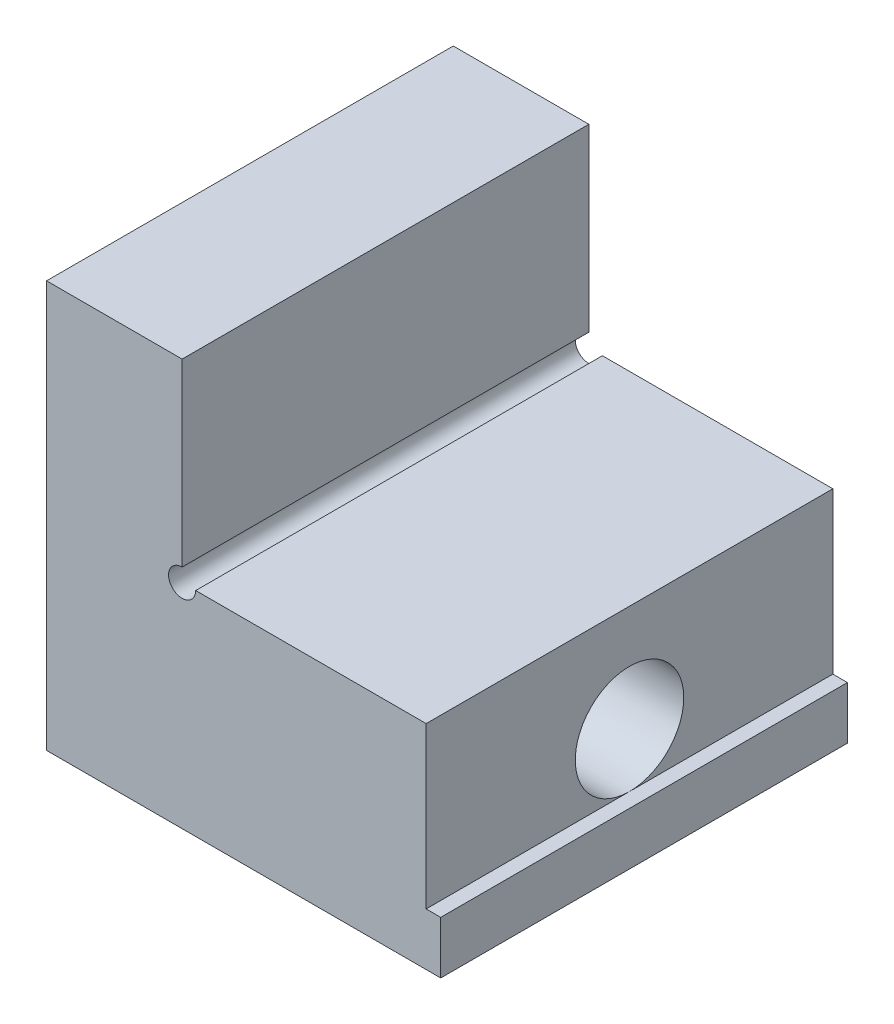
ISO-10303-21;
HEADER;
FILE_DESCRIPTION(('STEP AP214'),'2;1');
FILE_NAME('part.step','',(''),(''),'','','');
FILE_SCHEMA(('AUTOMOTIVE_DESIGN { 1 0 10303 214 1 1 1 1 }'));
ENDSEC;
DATA;
#1=APPLICATION_CONTEXT('core data for automotive mechanical design processes');
#2=APPLICATION_PROTOCOL_DEFINITION('international standard','automotive_design',2000,#1);
#3=PRODUCT_CONTEXT('',#1,'mechanical');
#4=PRODUCT('Part','Part','',(#3));
#5=PRODUCT_RELATED_PRODUCT_CATEGORY('part','',(#4));
#6=PRODUCT_DEFINITION_FORMATION('','',#4);
#7=PRODUCT_DEFINITION_CONTEXT('part definition',#1,'design');
#8=PRODUCT_DEFINITION('design','',#6,#7);
#9=PRODUCT_DEFINITION_SHAPE('','',#8);
#10=(LENGTH_UNIT() NAMED_UNIT(*) SI_UNIT(.MILLI.,.METRE.));
#11=(NAMED_UNIT(*) PLANE_ANGLE_UNIT() SI_UNIT($,.RADIAN.));
#12=(NAMED_UNIT(*) SI_UNIT($,.STERADIAN.) SOLID_ANGLE_UNIT());
#13=UNCERTAINTY_MEASURE_WITH_UNIT(LENGTH_MEASURE(1.E-05),#10,'distance_accuracy_value','');
#14=(GEOMETRIC_REPRESENTATION_CONTEXT(3) GLOBAL_UNCERTAINTY_ASSIGNED_CONTEXT((#13)) GLOBAL_UNIT_ASSIGNED_CONTEXT((#10,
#11,#12)) REPRESENTATION_CONTEXT('',''));
#15=CARTESIAN_POINT('',(0.,0.,0.));
#16=DIRECTION('',(0.,0.,1.));
#17=DIRECTION('',(1.,0.,0.));
#18=AXIS2_PLACEMENT_3D('',#15,#16,#17);
#19=CARTESIAN_POINT('',(0.,0.,15.));
#20=DIRECTION('',(0.,0.,-1.));
#21=DIRECTION('',(-1.,0.,0.));
#22=AXIS2_PLACEMENT_3D('',#19,#20,#21);
#23=CYLINDRICAL_SURFACE('',#22,1.);
#24=DIRECTION('',(0.,0.,-1.));
#25=VECTOR('',#24,1.);
#26=CARTESIAN_POINT('',(1.,0.,15.));
#27=LINE('',#26,#25);
#28=CARTESIAN_POINT('',(1.,0.,15.));
#29=VERTEX_POINT('',#28);
#30=CARTESIAN_POINT('',(1.,0.,-15.));
#31=VERTEX_POINT('',#30);
#32=EDGE_CURVE('E58',#29,#31,#27,.T.);
#33=ORIENTED_EDGE('',*,*,#32,.T.);
#34=CARTESIAN_POINT('',(0.,0.,-15.));
#35=DIRECTION('',(0.,0.,1.));
#36=DIRECTION('',(1.,0.,0.));
#37=AXIS2_PLACEMENT_3D('',#34,#35,#36);
#38=CIRCLE('',#37,1.);
#39=CARTESIAN_POINT('',(0.,1.,-15.));
#40=VERTEX_POINT('',#39);
#41=EDGE_CURVE('E124',#40,#31,#38,.T.);
#42=ORIENTED_EDGE('',*,*,#41,.F.);
#43=DIRECTION('',(0.,0.,-1.));
#44=VECTOR('',#43,1.);
#45=CARTESIAN_POINT('',(0.,1.,15.));
#46=LINE('',#45,#44);
#47=CARTESIAN_POINT('',(0.,1.,15.));
#48=VERTEX_POINT('',#47);
#49=EDGE_CURVE('E11',#48,#40,#46,.T.);
#50=ORIENTED_EDGE('',*,*,#49,.F.);
#51=CARTESIAN_POINT('',(0.,0.,15.));
#52=DIRECTION('',(0.,0.,1.));
#53=DIRECTION('',(1.,0.,0.));
#54=AXIS2_PLACEMENT_3D('',#51,#52,#53);
#55=CIRCLE('',#54,1.);
#56=EDGE_CURVE('E151',#48,#29,#55,.T.);
#57=ORIENTED_EDGE('',*,*,#56,.T.);
#58=EDGE_LOOP('',(#33,#42,#50,#57));
#59=FACE_BOUND('',#58,.T.);
#60=ADVANCED_FACE('F37',(#59),#23,.F.);
#61=CARTESIAN_POINT('',(0.,0.,15.));
#62=DIRECTION('',(1.,0.,0.));
#63=DIRECTION('',(0.,1.,0.));
#64=AXIS2_PLACEMENT_3D('',#61,#62,#63);
#65=PLANE('',#64);
#66=ORIENTED_EDGE('',*,*,#49,.T.);
#67=DIRECTION('',(0.,-1.,0.));
#68=VECTOR('',#67,1.);
#69=CARTESIAN_POINT('',(0.,0.,-15.));
#70=LINE('',#69,#68);
#71=CARTESIAN_POINT('',(0.,14.2850389755494,-15.));
#72=VERTEX_POINT('',#71);
#73=EDGE_CURVE('E113',#72,#40,#70,.T.);
#74=ORIENTED_EDGE('',*,*,#73,.F.);
#75=DIRECTION('',(0.,0.,-1.));
#76=VECTOR('',#75,1.);
#77=CARTESIAN_POINT('',(0.,14.2850389755494,15.));
#78=LINE('',#77,#76);
#79=CARTESIAN_POINT('',(0.,14.2850389755494,15.));
#80=VERTEX_POINT('',#79);
#81=EDGE_CURVE('E45',#80,#72,#78,.T.);
#82=ORIENTED_EDGE('',*,*,#81,.F.);
#83=DIRECTION('',(0.,-1.,0.));
#84=VECTOR('',#83,1.);
#85=CARTESIAN_POINT('',(0.,0.,15.));
#86=LINE('',#85,#84);
#87=EDGE_CURVE('E115',#80,#48,#86,.T.);
#88=ORIENTED_EDGE('',*,*,#87,.T.);
#89=EDGE_LOOP('',(#66,#74,#82,#88));
#90=FACE_BOUND('',#89,.T.);
#91=ADVANCED_FACE('F112',(#90),#65,.T.);
#92=CARTESIAN_POINT('',(0.,14.2850389755494,15.));
#93=DIRECTION('',(0.,1.,0.));
#94=DIRECTION('',(0.,0.,1.));
#95=AXIS2_PLACEMENT_3D('',#92,#93,#94);
#96=PLANE('',#95);
#97=ORIENTED_EDGE('',*,*,#81,.T.);
#98=DIRECTION('',(1.,0.,0.));
#99=VECTOR('',#98,1.);
#100=CARTESIAN_POINT('',(0.,14.2850389755494,-15.));
#101=LINE('',#100,#99);
#102=CARTESIAN_POINT('',(-10.,14.2850389755494,-15.));
#103=VERTEX_POINT('',#102);
#104=EDGE_CURVE('E127',#103,#72,#101,.T.);
#105=ORIENTED_EDGE('',*,*,#104,.F.);
#106=DIRECTION('',(0.,0.,-1.));
#107=VECTOR('',#106,1.);
#108=CARTESIAN_POINT('',(-10.,14.2850389755494,15.));
#109=LINE('',#108,#107);
#110=CARTESIAN_POINT('',(-10.,14.2850389755494,15.));
#111=VERTEX_POINT('',#110);
#112=EDGE_CURVE('E187',#111,#103,#109,.T.);
#113=ORIENTED_EDGE('',*,*,#112,.F.);
#114=DIRECTION('',(1.,0.,0.));
#115=VECTOR('',#114,1.);
#116=CARTESIAN_POINT('',(0.,14.2850389755494,15.));
#117=LINE('',#116,#115);
#118=EDGE_CURVE('E154',#111,#80,#117,.T.);
#119=ORIENTED_EDGE('',*,*,#118,.T.);
#120=EDGE_LOOP('',(#97,#105,#113,#119));
#121=FACE_BOUND('',#120,.T.);
#122=ADVANCED_FACE('F215',(#121),#96,.T.);
#123=CARTESIAN_POINT('',(-10.,0.,15.));
#124=DIRECTION('',(-1.,0.,0.));
#125=DIRECTION('',(0.,0.,1.));
#126=AXIS2_PLACEMENT_3D('',#123,#124,#125);
#127=PLANE('',#126);
#128=CARTESIAN_POINT('',(-10.,-7.84,0.));
#129=DIRECTION('',(-1.,0.,0.));
#130=DIRECTION('',(0.,0.,1.));
#131=AXIS2_PLACEMENT_3D('',#128,#129,#130);
#132=CIRCLE('',#131,6.5);
#133=CARTESIAN_POINT('',(-10.,-7.84,6.5));
#134=VERTEX_POINT('',#133);
#135=EDGE_CURVE('E40',#134,#134,#132,.T.);
#136=ORIENTED_EDGE('',*,*,#135,.F.);
#137=EDGE_LOOP('',(#136));
#138=FACE_BOUND('',#137,.T.);
#139=ORIENTED_EDGE('',*,*,#112,.T.);
#140=DIRECTION('',(0.,1.,0.));
#141=VECTOR('',#140,1.);
#142=CARTESIAN_POINT('',(-10.,0.,-15.));
#143=LINE('',#142,#141);
#144=CARTESIAN_POINT('',(-10.,-15.7149610244506,-15.));
#145=VERTEX_POINT('',#144);
#146=EDGE_CURVE('E135',#145,#103,#143,.T.);
#147=ORIENTED_EDGE('',*,*,#146,.F.);
#148=DIRECTION('',(0.,0.,-1.));
#149=VECTOR('',#148,1.);
#150=CARTESIAN_POINT('',(-10.,-15.7149610244506,15.));
#151=LINE('',#150,#149);
#152=CARTESIAN_POINT('',(-10.,-15.7149610244506,15.));
#153=VERTEX_POINT('',#152);
#154=EDGE_CURVE('E185',#153,#145,#151,.T.);
#155=ORIENTED_EDGE('',*,*,#154,.F.);
#156=DIRECTION('',(0.,1.,0.));
#157=VECTOR('',#156,1.);
#158=CARTESIAN_POINT('',(-10.,0.,15.));
#159=LINE('',#158,#157);
#160=EDGE_CURVE('E157',#153,#111,#159,.T.);
#161=ORIENTED_EDGE('',*,*,#160,.T.);
#162=EDGE_LOOP('',(#139,#147,#155,#161));
#163=FACE_BOUND('',#162,.T.);
#164=ADVANCED_FACE('F219',(#138,#163),#127,.T.);
#165=CARTESIAN_POINT('',(0.,-15.7149610244506,15.));
#166=DIRECTION('',(0.,-1.,0.));
#167=DIRECTION('',(1.,0.,0.));
#168=AXIS2_PLACEMENT_3D('',#165,#166,#167);
#169=PLANE('',#168);
#170=ORIENTED_EDGE('',*,*,#154,.T.);
#171=DIRECTION('',(-1.,0.,0.));
#172=VECTOR('',#171,1.);
#173=CARTESIAN_POINT('',(0.,-15.7149610244506,-15.));
#174=LINE('',#173,#172);
#175=CARTESIAN_POINT('',(19.0754,-15.7149610244505,-15.));
#176=VERTEX_POINT('',#175);
#177=EDGE_CURVE('E137',#176,#145,#174,.T.);
#178=ORIENTED_EDGE('',*,*,#177,.F.);
#179=DIRECTION('',(0.,0.,-1.));
#180=VECTOR('',#179,1.);
#181=CARTESIAN_POINT('',(19.0754,-15.7149610244505,15.));
#182=LINE('',#181,#180);
#183=CARTESIAN_POINT('',(19.0754,-15.7149610244505,15.));
#184=VERTEX_POINT('',#183);
#185=EDGE_CURVE('E183',#184,#176,#182,.T.);
#186=ORIENTED_EDGE('',*,*,#185,.F.);
#187=DIRECTION('',(-1.,0.,0.));
#188=VECTOR('',#187,1.);
#189=CARTESIAN_POINT('',(0.,-15.7149610244506,15.));
#190=LINE('',#189,#188);
#191=EDGE_CURVE('E160',#184,#153,#190,.T.);
#192=ORIENTED_EDGE('',*,*,#191,.T.);
#193=EDGE_LOOP('',(#170,#178,#186,#192));
#194=FACE_BOUND('',#193,.T.);
#195=ADVANCED_FACE('F225',(#194),#169,.T.);
#196=CARTESIAN_POINT('',(19.0754,0.,15.));
#197=DIRECTION('',(1.,0.,0.));
#198=DIRECTION('',(0.,1.,0.));
#199=AXIS2_PLACEMENT_3D('',#196,#197,#198);
#200=PLANE('',#199);
#201=ORIENTED_EDGE('',*,*,#185,.T.);
#202=DIRECTION('',(0.,-1.,0.));
#203=VECTOR('',#202,1.);
#204=CARTESIAN_POINT('',(19.0754,0.,-15.));
#205=LINE('',#204,#203);
#206=CARTESIAN_POINT('',(19.0754,-11.84,-15.));
#207=VERTEX_POINT('',#206);
#208=EDGE_CURVE('E140',#207,#176,#205,.T.);
#209=ORIENTED_EDGE('',*,*,#208,.F.);
#210=DIRECTION('',(0.,0.,-1.));
#211=VECTOR('',#210,1.);
#212=CARTESIAN_POINT('',(19.0754,-11.84,15.));
#213=LINE('',#212,#211);
#214=CARTESIAN_POINT('',(19.0754,-11.84,15.));
#215=VERTEX_POINT('',#214);
#216=EDGE_CURVE('E181',#215,#207,#213,.T.);
#217=ORIENTED_EDGE('',*,*,#216,.F.);
#218=DIRECTION('',(0.,-1.,0.));
#219=VECTOR('',#218,1.);
#220=CARTESIAN_POINT('',(19.0754,0.,15.));
#221=LINE('',#220,#219);
#222=EDGE_CURVE('E163',#215,#184,#221,.T.);
#223=ORIENTED_EDGE('',*,*,#222,.T.);
#224=EDGE_LOOP('',(#201,#209,#217,#223));
#225=FACE_BOUND('',#224,.T.);
#226=ADVANCED_FACE('F229',(#225),#200,.T.);
#227=CARTESIAN_POINT('',(0.,-11.84,15.));
#228=DIRECTION('',(0.,1.,0.));
#229=DIRECTION('',(0.,0.,1.));
#230=AXIS2_PLACEMENT_3D('',#227,#228,#229);
#231=PLANE('',#230);
#232=ORIENTED_EDGE('',*,*,#216,.T.);
#233=DIRECTION('',(1.,0.,0.));
#234=VECTOR('',#233,1.);
#235=CARTESIAN_POINT('',(0.,-11.84,-15.));
#236=LINE('',#235,#234);
#237=CARTESIAN_POINT('',(18.,-11.84,-15.));
#238=VERTEX_POINT('',#237);
#239=EDGE_CURVE('E143',#238,#207,#236,.T.);
#240=ORIENTED_EDGE('',*,*,#239,.F.);
#241=DIRECTION('',(0.,0.,-1.));
#242=VECTOR('',#241,1.);
#243=CARTESIAN_POINT('',(18.,-11.84,15.));
#244=LINE('',#243,#242);
#245=CARTESIAN_POINT('',(18.,-11.84,0.));
#246=VERTEX_POINT('',#245);
#247=EDGE_CURVE('E177',#246,#238,#244,.T.);
#248=ORIENTED_EDGE('',*,*,#247,.F.);
#249=CARTESIAN_POINT('',(18.,-11.84,15.));
#250=VERTEX_POINT('',#249);
#251=EDGE_CURVE('E178',#250,#246,#244,.T.);
#252=ORIENTED_EDGE('',*,*,#251,.F.);
#253=DIRECTION('',(1.,0.,0.));
#254=VECTOR('',#253,1.);
#255=CARTESIAN_POINT('',(0.,-11.84,15.));
#256=LINE('',#255,#254);
#257=EDGE_CURVE('E166',#250,#215,#256,.T.);
#258=ORIENTED_EDGE('',*,*,#257,.T.);
#259=EDGE_LOOP('',(#232,#240,#248,#252,#258));
#260=FACE_BOUND('',#259,.T.);
#261=ADVANCED_FACE('F233',(#260),#231,.T.);
#262=CARTESIAN_POINT('',(18.,0.,15.));
#263=DIRECTION('',(1.,0.,0.));
#264=DIRECTION('',(0.,0.,-1.));
#265=AXIS2_PLACEMENT_3D('',#262,#263,#264);
#266=PLANE('',#265);
#267=ORIENTED_EDGE('',*,*,#251,.T.);
#268=CARTESIAN_POINT('',(18.,-7.84,0.));
#269=DIRECTION('',(1.,0.,0.));
#270=DIRECTION('',(0.,0.,-1.));
#271=AXIS2_PLACEMENT_3D('',#268,#269,#270);
#272=CIRCLE('',#271,4.);
#273=EDGE_CURVE('E51',#246,#246,#272,.T.);
#274=ORIENTED_EDGE('',*,*,#273,.F.);
#275=ORIENTED_EDGE('',*,*,#247,.T.);
#276=DIRECTION('',(0.,-1.,0.));
#277=VECTOR('',#276,1.);
#278=CARTESIAN_POINT('',(18.,0.,-15.));
#279=LINE('',#278,#277);
#280=CARTESIAN_POINT('',(18.,0.,-15.));
#281=VERTEX_POINT('',#280);
#282=EDGE_CURVE('E146',#281,#238,#279,.T.);
#283=ORIENTED_EDGE('',*,*,#282,.F.);
#284=DIRECTION('',(0.,0.,-1.));
#285=VECTOR('',#284,1.);
#286=CARTESIAN_POINT('',(18.,0.,15.));
#287=LINE('',#286,#285);
#288=CARTESIAN_POINT('',(18.,0.,15.));
#289=VERTEX_POINT('',#288);
#290=EDGE_CURVE('E175',#289,#281,#287,.T.);
#291=ORIENTED_EDGE('',*,*,#290,.F.);
#292=DIRECTION('',(0.,-1.,0.));
#293=VECTOR('',#292,1.);
#294=CARTESIAN_POINT('',(18.,0.,15.));
#295=LINE('',#294,#293);
#296=EDGE_CURVE('E169',#289,#250,#295,.T.);
#297=ORIENTED_EDGE('',*,*,#296,.T.);
#298=EDGE_LOOP('',(#267,#274,#275,#283,#291,#297));
#299=FACE_BOUND('',#298,.T.);
#300=ADVANCED_FACE('F237',(#299),#266,.T.);
#301=CARTESIAN_POINT('',(0.,0.,15.));
#302=DIRECTION('',(0.,1.,0.));
#303=DIRECTION('',(0.,0.,1.));
#304=AXIS2_PLACEMENT_3D('',#301,#302,#303);
#305=PLANE('',#304);
#306=ORIENTED_EDGE('',*,*,#290,.T.);
#307=DIRECTION('',(1.,0.,0.));
#308=VECTOR('',#307,1.);
#309=CARTESIAN_POINT('',(0.,0.,-15.));
#310=LINE('',#309,#308);
#311=EDGE_CURVE('E149',#31,#281,#310,.T.);
#312=ORIENTED_EDGE('',*,*,#311,.F.);
#313=ORIENTED_EDGE('',*,*,#32,.F.);
#314=DIRECTION('',(1.,0.,0.));
#315=VECTOR('',#314,1.);
#316=CARTESIAN_POINT('',(0.,0.,15.));
#317=LINE('',#316,#315);
#318=EDGE_CURVE('E172',#29,#289,#317,.T.);
#319=ORIENTED_EDGE('',*,*,#318,.T.);
#320=EDGE_LOOP('',(#306,#312,#313,#319));
#321=FACE_BOUND('',#320,.T.);
#322=ADVANCED_FACE('F241',(#321),#305,.T.);
#323=CARTESIAN_POINT('',(0.,0.,15.));
#324=DIRECTION('',(0.,0.,1.));
#325=DIRECTION('',(1.,0.,0.));
#326=AXIS2_PLACEMENT_3D('',#323,#324,#325);
#327=PLANE('',#326);
#328=ORIENTED_EDGE('',*,*,#56,.F.);
#329=ORIENTED_EDGE('',*,*,#87,.F.);
#330=ORIENTED_EDGE('',*,*,#118,.F.);
#331=ORIENTED_EDGE('',*,*,#160,.F.);
#332=ORIENTED_EDGE('',*,*,#191,.F.);
#333=ORIENTED_EDGE('',*,*,#222,.F.);
#334=ORIENTED_EDGE('',*,*,#257,.F.);
#335=ORIENTED_EDGE('',*,*,#296,.F.);
#336=ORIENTED_EDGE('',*,*,#318,.F.);
#337=EDGE_LOOP('',(#328,#329,#330,#331,#332,#333,#334,#335,#336));
#338=FACE_BOUND('',#337,.T.);
#339=ADVANCED_FACE('F245',(#338),#327,.T.);
#340=CARTESIAN_POINT('',(0.,0.,-15.));
#341=DIRECTION('',(0.,0.,1.));
#342=DIRECTION('',(1.,0.,0.));
#343=AXIS2_PLACEMENT_3D('',#340,#341,#342);
#344=PLANE('',#343);
#345=ORIENTED_EDGE('',*,*,#41,.T.);
#346=ORIENTED_EDGE('',*,*,#311,.T.);
#347=ORIENTED_EDGE('',*,*,#282,.T.);
#348=ORIENTED_EDGE('',*,*,#239,.T.);
#349=ORIENTED_EDGE('',*,*,#208,.T.);
#350=ORIENTED_EDGE('',*,*,#177,.T.);
#351=ORIENTED_EDGE('',*,*,#146,.T.);
#352=ORIENTED_EDGE('',*,*,#104,.T.);
#353=ORIENTED_EDGE('',*,*,#73,.T.);
#354=EDGE_LOOP('',(#345,#346,#347,#348,#349,#350,#351,#352,#353));
#355=FACE_BOUND('',#354,.T.);
#356=ADVANCED_FACE('F122',(#355),#344,.F.);
#357=CARTESIAN_POINT('',(-30.,-7.84,0.));
#358=DIRECTION('',(1.,0.,0.));
#359=DIRECTION('',(0.,0.,-1.));
#360=AXIS2_PLACEMENT_3D('',#357,#358,#359);
#361=CYLINDRICAL_SURFACE('',#360,4.);
#362=CARTESIAN_POINT('',(0.,-7.84,0.));
#363=DIRECTION('',(1.,0.,0.));
#364=DIRECTION('',(0.,0.,-1.));
#365=AXIS2_PLACEMENT_3D('',#362,#363,#364);
#366=CIRCLE('',#365,4.);
#367=CARTESIAN_POINT('',(0.,-7.84,-4.));
#368=VERTEX_POINT('',#367);
#369=EDGE_CURVE('E189',#368,#368,#366,.F.);
#370=ORIENTED_EDGE('',*,*,#369,.T.);
#371=EDGE_LOOP('',(#370));
#372=FACE_BOUND('',#371,.T.);
#373=ORIENTED_EDGE('',*,*,#273,.T.);
#374=EDGE_LOOP('',(#373));
#375=FACE_BOUND('',#374,.T.);
#376=ADVANCED_FACE('F202',(#372,#375),#361,.F.);
#377=CARTESIAN_POINT('',(0.,-7.84,0.));
#378=DIRECTION('',(1.,0.,0.));
#379=DIRECTION('',(0.,0.,-1.));
#380=AXIS2_PLACEMENT_3D('',#377,#378,#379);
#381=PLANE('',#380);
#382=CARTESIAN_POINT('',(0.,-7.84,0.));
#383=DIRECTION('',(1.,0.,0.));
#384=DIRECTION('',(0.,0.,-1.));
#385=AXIS2_PLACEMENT_3D('',#382,#383,#384);
#386=CIRCLE('',#385,6.5);
#387=CARTESIAN_POINT('',(0.,-7.84,-6.5));
#388=VERTEX_POINT('',#387);
#389=EDGE_CURVE('E132',#388,#388,#386,.T.);
#390=ORIENTED_EDGE('',*,*,#389,.F.);
#391=EDGE_LOOP('',(#390));
#392=FACE_BOUND('',#391,.T.);
#393=ORIENTED_EDGE('',*,*,#369,.F.);
#394=EDGE_LOOP('',(#393));
#395=FACE_BOUND('',#394,.T.);
#396=ADVANCED_FACE('F199',(#392,#395),#381,.F.);
#397=CARTESIAN_POINT('',(-18.2,-7.84,0.));
#398=DIRECTION('',(1.,0.,0.));
#399=DIRECTION('',(0.,0.,-1.));
#400=AXIS2_PLACEMENT_3D('',#397,#398,#399);
#401=CYLINDRICAL_SURFACE('',#400,6.5);
#402=ORIENTED_EDGE('',*,*,#135,.T.);
#403=EDGE_LOOP('',(#402));
#404=FACE_BOUND('',#403,.T.);
#405=ORIENTED_EDGE('',*,*,#389,.T.);
#406=EDGE_LOOP('',(#405));
#407=FACE_BOUND('',#406,.T.);
#408=ADVANCED_FACE('F197',(#404,#407),#401,.F.);
#409=CLOSED_SHELL('',(#60,#91,#122,#164,#195,#226,#261,#300,#322,#339,#356,#376,#396,#408));
#410=MANIFOLD_SOLID_BREP('B2',#409);
#411=ADVANCED_BREP_SHAPE_REPRESENTATION('',(#18,#410),#14);
#412=SHAPE_DEFINITION_REPRESENTATION(#9,#411);
ENDSEC;
END-ISO-10303-21;
